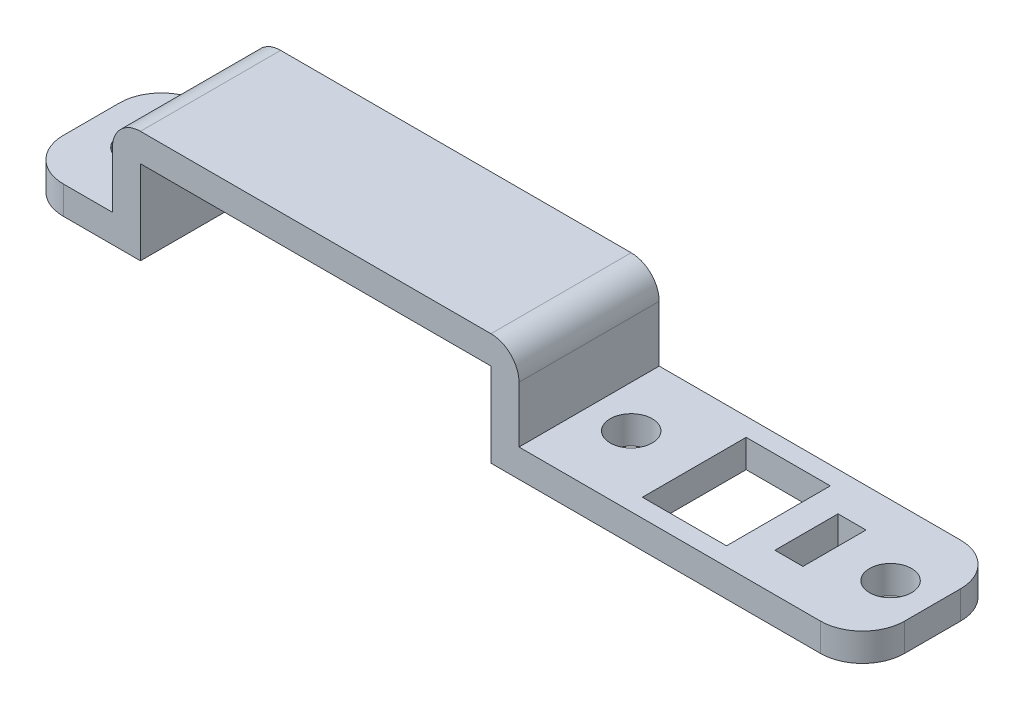
ISO-10303-21;
HEADER;
FILE_DESCRIPTION(('STEP AP214'),'2;1');
FILE_NAME('part.step','',(''),(''),'','','');
FILE_SCHEMA(('AUTOMOTIVE_DESIGN { 1 0 10303 214 1 1 1 1 }'));
ENDSEC;
DATA;
#1=APPLICATION_CONTEXT('core data for automotive mechanical design processes');
#2=APPLICATION_PROTOCOL_DEFINITION('international standard','automotive_design',2000,#1);
#3=PRODUCT_CONTEXT('',#1,'mechanical');
#4=PRODUCT('Part','Part','',(#3));
#5=PRODUCT_RELATED_PRODUCT_CATEGORY('part','',(#4));
#6=PRODUCT_DEFINITION_FORMATION('','',#4);
#7=PRODUCT_DEFINITION_CONTEXT('part definition',#1,'design');
#8=PRODUCT_DEFINITION('design','',#6,#7);
#9=PRODUCT_DEFINITION_SHAPE('','',#8);
#10=(LENGTH_UNIT() NAMED_UNIT(*) SI_UNIT(.MILLI.,.METRE.));
#11=(NAMED_UNIT(*) PLANE_ANGLE_UNIT() SI_UNIT($,.RADIAN.));
#12=(NAMED_UNIT(*) SI_UNIT($,.STERADIAN.) SOLID_ANGLE_UNIT());
#13=UNCERTAINTY_MEASURE_WITH_UNIT(LENGTH_MEASURE(1.E-05),#10,'distance_accuracy_value','');
#14=(GEOMETRIC_REPRESENTATION_CONTEXT(3) GLOBAL_UNCERTAINTY_ASSIGNED_CONTEXT((#13)) GLOBAL_UNIT_ASSIGNED_CONTEXT((#10,
#11,#12)) REPRESENTATION_CONTEXT('',''));
#15=CARTESIAN_POINT('',(0.,0.,0.));
#16=DIRECTION('',(0.,0.,1.));
#17=DIRECTION('',(1.,0.,0.));
#18=AXIS2_PLACEMENT_3D('',#15,#16,#17);
#19=CARTESIAN_POINT('',(32.5,0.,-10.));
#20=DIRECTION('',(0.,-1.,0.));
#21=DIRECTION('',(0.,0.,-1.));
#22=AXIS2_PLACEMENT_3D('',#19,#20,#21);
#23=PLANE('',#22);
#24=DIRECTION('',(0.,0.,1.));
#25=VECTOR('',#24,1.);
#26=CARTESIAN_POINT('',(42.,0.,-8.7));
#27=LINE('',#26,#25);
#28=CARTESIAN_POINT('',(42.,0.,-8.7));
#29=VERTEX_POINT('',#28);
#30=CARTESIAN_POINT('',(42.,0.,-1.3));
#31=VERTEX_POINT('',#30);
#32=EDGE_CURVE('E216',#29,#31,#27,.T.);
#33=ORIENTED_EDGE('',*,*,#32,.T.);
#34=DIRECTION('',(1.,0.,0.));
#35=VECTOR('',#34,1.);
#36=CARTESIAN_POINT('',(42.,0.,-1.3));
#37=LINE('',#36,#35);
#38=CARTESIAN_POINT('',(48.,0.,-1.3));
#39=VERTEX_POINT('',#38);
#40=EDGE_CURVE('E228',#31,#39,#37,.T.);
#41=ORIENTED_EDGE('',*,*,#40,.T.);
#42=DIRECTION('',(0.,0.,-1.));
#43=VECTOR('',#42,1.);
#44=CARTESIAN_POINT('',(48.,0.,-8.7));
#45=LINE('',#44,#43);
#46=CARTESIAN_POINT('',(48.,0.,-8.7));
#47=VERTEX_POINT('',#46);
#48=EDGE_CURVE('E55',#39,#47,#45,.T.);
#49=ORIENTED_EDGE('',*,*,#48,.T.);
#50=DIRECTION('',(-1.,0.,0.));
#51=VECTOR('',#50,1.);
#52=CARTESIAN_POINT('',(42.,0.,-8.7));
#53=LINE('',#52,#51);
#54=EDGE_CURVE('E225',#47,#29,#53,.T.);
#55=ORIENTED_EDGE('',*,*,#54,.T.);
#56=EDGE_LOOP('',(#33,#41,#49,#55));
#57=FACE_BOUND('',#56,.T.);
#58=DIRECTION('',(0.,0.,1.));
#59=VECTOR('',#58,1.);
#60=CARTESIAN_POINT('',(50.,0.,-7.25));
#61=LINE('',#60,#59);
#62=CARTESIAN_POINT('',(50.,0.,-7.25));
#63=VERTEX_POINT('',#62);
#64=CARTESIAN_POINT('',(50.,0.,-2.75));
#65=VERTEX_POINT('',#64);
#66=EDGE_CURVE('E265',#63,#65,#61,.T.);
#67=ORIENTED_EDGE('',*,*,#66,.T.);
#68=DIRECTION('',(1.,0.,0.));
#69=VECTOR('',#68,1.);
#70=CARTESIAN_POINT('',(50.,0.,-2.75));
#71=LINE('',#70,#69);
#72=CARTESIAN_POINT('',(52.,0.,-2.75));
#73=VERTEX_POINT('',#72);
#74=EDGE_CURVE('E269',#65,#73,#71,.T.);
#75=ORIENTED_EDGE('',*,*,#74,.T.);
#76=DIRECTION('',(0.,0.,-1.));
#77=VECTOR('',#76,1.);
#78=CARTESIAN_POINT('',(52.,0.,-7.25));
#79=LINE('',#78,#77);
#80=CARTESIAN_POINT('',(52.,0.,-7.25));
#81=VERTEX_POINT('',#80);
#82=EDGE_CURVE('E63',#73,#81,#79,.T.);
#83=ORIENTED_EDGE('',*,*,#82,.T.);
#84=DIRECTION('',(-1.,0.,0.));
#85=VECTOR('',#84,1.);
#86=CARTESIAN_POINT('',(50.,0.,-7.25));
#87=LINE('',#86,#85);
#88=EDGE_CURVE('E276',#81,#63,#87,.T.);
#89=ORIENTED_EDGE('',*,*,#88,.T.);
#90=EDGE_LOOP('',(#67,#75,#83,#89));
#91=FACE_BOUND('',#90,.T.);
#92=CARTESIAN_POINT('',(37.5,0.,-5.));
#93=DIRECTION('',(0.,1.,0.));
#94=DIRECTION('',(0.,0.,1.));
#95=AXIS2_PLACEMENT_3D('',#92,#93,#94);
#96=CIRCLE('',#95,1.5);
#97=CARTESIAN_POINT('',(37.5,0.,-3.5));
#98=VERTEX_POINT('',#97);
#99=EDGE_CURVE('E315',#98,#98,#96,.T.);
#100=ORIENTED_EDGE('',*,*,#99,.T.);
#101=EDGE_LOOP('',(#100));
#102=FACE_BOUND('',#101,.T.);
#103=CARTESIAN_POINT('',(56.,0.,-5.));
#104=DIRECTION('',(0.,1.,0.));
#105=DIRECTION('',(0.,0.,1.));
#106=AXIS2_PLACEMENT_3D('',#103,#104,#105);
#107=CIRCLE('',#106,1.5);
#108=CARTESIAN_POINT('',(56.,0.,-3.5));
#109=VERTEX_POINT('',#108);
#110=EDGE_CURVE('E323',#109,#109,#107,.T.);
#111=ORIENTED_EDGE('',*,*,#110,.T.);
#112=EDGE_LOOP('',(#111));
#113=FACE_BOUND('',#112,.T.);
#114=DIRECTION('',(1.,0.,0.));
#115=VECTOR('',#114,1.);
#116=CARTESIAN_POINT('',(41.5,0.,-10.));
#117=LINE('',#116,#115);
#118=CARTESIAN_POINT('',(32.5,0.,-10.));
#119=VERTEX_POINT('',#118);
#120=CARTESIAN_POINT('',(56.,0.,-10.));
#121=VERTEX_POINT('',#120);
#122=EDGE_CURVE('E330',#119,#121,#117,.T.);
#123=ORIENTED_EDGE('',*,*,#122,.T.);
#124=CARTESIAN_POINT('',(56.,0.,-7.));
#125=DIRECTION('',(0.,-1.,0.));
#126=DIRECTION('',(0.,0.,-1.));
#127=AXIS2_PLACEMENT_3D('',#124,#125,#126);
#128=CIRCLE('',#127,3.);
#129=CARTESIAN_POINT('',(59.,0.,-7.));
#130=VERTEX_POINT('',#129);
#131=EDGE_CURVE('E476',#121,#130,#128,.T.);
#132=ORIENTED_EDGE('',*,*,#131,.T.);
#133=DIRECTION('',(0.,0.,1.));
#134=VECTOR('',#133,1.);
#135=CARTESIAN_POINT('',(59.,0.,-10.));
#136=LINE('',#135,#134);
#137=CARTESIAN_POINT('',(59.,0.,-3.));
#138=VERTEX_POINT('',#137);
#139=EDGE_CURVE('E368',#130,#138,#136,.T.);
#140=ORIENTED_EDGE('',*,*,#139,.T.);
#141=CARTESIAN_POINT('',(56.,0.,-3.));
#142=DIRECTION('',(0.,-1.,0.));
#143=DIRECTION('',(0.,0.,-1.));
#144=AXIS2_PLACEMENT_3D('',#141,#142,#143);
#145=CIRCLE('',#144,3.);
#146=CARTESIAN_POINT('',(56.,0.,0.));
#147=VERTEX_POINT('',#146);
#148=EDGE_CURVE('E473',#138,#147,#145,.T.);
#149=ORIENTED_EDGE('',*,*,#148,.T.);
#150=DIRECTION('',(1.,0.,0.));
#151=VECTOR('',#150,1.);
#152=CARTESIAN_POINT('',(32.5,0.,0.));
#153=LINE('',#152,#151);
#154=CARTESIAN_POINT('',(32.5,0.,0.));
#155=VERTEX_POINT('',#154);
#156=EDGE_CURVE('E335',#155,#147,#153,.T.);
#157=ORIENTED_EDGE('',*,*,#156,.F.);
#158=DIRECTION('',(0.,0.,1.));
#159=VECTOR('',#158,1.);
#160=CARTESIAN_POINT('',(32.5,0.,-10.));
#161=LINE('',#160,#159);
#162=EDGE_CURVE('E404',#119,#155,#161,.T.);
#163=ORIENTED_EDGE('',*,*,#162,.F.);
#164=EDGE_LOOP('',(#123,#132,#140,#149,#157,#163));
#165=FACE_BOUND('',#164,.T.);
#166=ADVANCED_FACE('F39',(#57,#91,#102,#113,#165),#23,.T.);
#167=CARTESIAN_POINT('',(32.5,6.,-10.));
#168=DIRECTION('',(-1.,0.,0.));
#169=DIRECTION('',(0.,0.,1.));
#170=AXIS2_PLACEMENT_3D('',#167,#168,#169);
#171=PLANE('',#170);
#172=DIRECTION('',(0.,-1.,0.));
#173=VECTOR('',#172,1.);
#174=CARTESIAN_POINT('',(32.5,6.,0.));
#175=LINE('',#174,#173);
#176=CARTESIAN_POINT('',(32.5,6.,0.));
#177=VERTEX_POINT('',#176);
#178=EDGE_CURVE('E397',#177,#155,#175,.T.);
#179=ORIENTED_EDGE('',*,*,#178,.F.);
#180=DIRECTION('',(0.,0.,1.));
#181=VECTOR('',#180,1.);
#182=CARTESIAN_POINT('',(32.5,6.,-10.));
#183=LINE('',#182,#181);
#184=CARTESIAN_POINT('',(32.5,6.,-10.));
#185=VERTEX_POINT('',#184);
#186=EDGE_CURVE('E408',#185,#177,#183,.T.);
#187=ORIENTED_EDGE('',*,*,#186,.F.);
#188=DIRECTION('',(0.,-1.,0.));
#189=VECTOR('',#188,1.);
#190=CARTESIAN_POINT('',(32.5,6.,-10.));
#191=LINE('',#190,#189);
#192=EDGE_CURVE('E364',#185,#119,#191,.T.);
#193=ORIENTED_EDGE('',*,*,#192,.T.);
#194=ORIENTED_EDGE('',*,*,#162,.T.);
#195=EDGE_LOOP('',(#179,#187,#193,#194));
#196=FACE_BOUND('',#195,.T.);
#197=ADVANCED_FACE('F576',(#196),#171,.T.);
#198=CARTESIAN_POINT('',(7.5,6.,-10.));
#199=DIRECTION('',(0.,-1.,0.));
#200=DIRECTION('',(0.,0.,-1.));
#201=AXIS2_PLACEMENT_3D('',#198,#199,#200);
#202=PLANE('',#201);
#203=DIRECTION('',(1.,0.,0.));
#204=VECTOR('',#203,1.);
#205=CARTESIAN_POINT('',(7.5,6.,0.));
#206=LINE('',#205,#204);
#207=CARTESIAN_POINT('',(7.5,6.,0.));
#208=VERTEX_POINT('',#207);
#209=EDGE_CURVE('E393',#208,#177,#206,.T.);
#210=ORIENTED_EDGE('',*,*,#209,.F.);
#211=DIRECTION('',(0.,0.,1.));
#212=VECTOR('',#211,1.);
#213=CARTESIAN_POINT('',(7.5,6.,-10.));
#214=LINE('',#213,#212);
#215=CARTESIAN_POINT('',(7.5,6.,-10.));
#216=VERTEX_POINT('',#215);
#217=EDGE_CURVE('E411',#216,#208,#214,.T.);
#218=ORIENTED_EDGE('',*,*,#217,.F.);
#219=DIRECTION('',(1.,0.,0.));
#220=VECTOR('',#219,1.);
#221=CARTESIAN_POINT('',(7.5,6.,-10.));
#222=LINE('',#221,#220);
#223=EDGE_CURVE('E360',#216,#185,#222,.T.);
#224=ORIENTED_EDGE('',*,*,#223,.T.);
#225=ORIENTED_EDGE('',*,*,#186,.T.);
#226=EDGE_LOOP('',(#210,#218,#224,#225));
#227=FACE_BOUND('',#226,.T.);
#228=ADVANCED_FACE('F574',(#227),#202,.T.);
#229=CARTESIAN_POINT('',(7.5,0.,-10.));
#230=DIRECTION('',(1.,0.,0.));
#231=DIRECTION('',(0.,0.,-1.));
#232=AXIS2_PLACEMENT_3D('',#229,#230,#231);
#233=PLANE('',#232);
#234=DIRECTION('',(0.,1.,0.));
#235=VECTOR('',#234,1.);
#236=CARTESIAN_POINT('',(7.5,0.,0.));
#237=LINE('',#236,#235);
#238=CARTESIAN_POINT('',(7.5,0.,0.));
#239=VERTEX_POINT('',#238);
#240=EDGE_CURVE('E389',#239,#208,#237,.T.);
#241=ORIENTED_EDGE('',*,*,#240,.F.);
#242=DIRECTION('',(0.,0.,1.));
#243=VECTOR('',#242,1.);
#244=CARTESIAN_POINT('',(7.5,0.,-10.));
#245=LINE('',#244,#243);
#246=CARTESIAN_POINT('',(7.5,0.,-10.));
#247=VERTEX_POINT('',#246);
#248=EDGE_CURVE('E414',#247,#239,#245,.T.);
#249=ORIENTED_EDGE('',*,*,#248,.F.);
#250=DIRECTION('',(0.,1.,0.));
#251=VECTOR('',#250,1.);
#252=CARTESIAN_POINT('',(7.5,0.,-10.));
#253=LINE('',#252,#251);
#254=EDGE_CURVE('E356',#247,#216,#253,.T.);
#255=ORIENTED_EDGE('',*,*,#254,.T.);
#256=ORIENTED_EDGE('',*,*,#217,.T.);
#257=EDGE_LOOP('',(#241,#249,#255,#256));
#258=FACE_BOUND('',#257,.T.);
#259=ADVANCED_FACE('F569',(#258),#233,.T.);
#260=CARTESIAN_POINT('',(0.,0.,-10.));
#261=DIRECTION('',(0.,-1.,0.));
#262=DIRECTION('',(0.,0.,-1.));
#263=AXIS2_PLACEMENT_3D('',#260,#261,#262);
#264=PLANE('',#263);
#265=CARTESIAN_POINT('',(2.5,0.,-5.));
#266=DIRECTION('',(0.,1.,0.));
#267=DIRECTION('',(0.,0.,1.));
#268=AXIS2_PLACEMENT_3D('',#265,#266,#267);
#269=CIRCLE('',#268,1.5);
#270=CARTESIAN_POINT('',(2.5,0.,-3.5));
#271=VERTEX_POINT('',#270);
#272=EDGE_CURVE('E306',#271,#271,#269,.T.);
#273=ORIENTED_EDGE('',*,*,#272,.T.);
#274=EDGE_LOOP('',(#273));
#275=FACE_BOUND('',#274,.T.);
#276=DIRECTION('',(0.,0.,1.));
#277=VECTOR('',#276,1.);
#278=CARTESIAN_POINT('',(-1.,0.,-10.));
#279=LINE('',#278,#277);
#280=CARTESIAN_POINT('',(-1.,0.,-7.));
#281=VERTEX_POINT('',#280);
#282=CARTESIAN_POINT('',(-1.,0.,-3.));
#283=VERTEX_POINT('',#282);
#284=EDGE_CURVE('E418',#281,#283,#279,.T.);
#285=ORIENTED_EDGE('',*,*,#284,.F.);
#286=CARTESIAN_POINT('',(2.,0.,-7.));
#287=DIRECTION('',(0.,-1.,0.));
#288=DIRECTION('',(0.,0.,-1.));
#289=AXIS2_PLACEMENT_3D('',#286,#287,#288);
#290=CIRCLE('',#289,3.);
#291=CARTESIAN_POINT('',(2.,0.,-10.));
#292=VERTEX_POINT('',#291);
#293=EDGE_CURVE('E464',#281,#292,#290,.T.);
#294=ORIENTED_EDGE('',*,*,#293,.T.);
#295=DIRECTION('',(1.,0.,0.));
#296=VECTOR('',#295,1.);
#297=CARTESIAN_POINT('',(0.,0.,-10.));
#298=LINE('',#297,#296);
#299=EDGE_CURVE('E353',#292,#247,#298,.T.);
#300=ORIENTED_EDGE('',*,*,#299,.T.);
#301=ORIENTED_EDGE('',*,*,#248,.T.);
#302=DIRECTION('',(1.,0.,0.));
#303=VECTOR('',#302,1.);
#304=CARTESIAN_POINT('',(0.,0.,0.));
#305=LINE('',#304,#303);
#306=CARTESIAN_POINT('',(2.,0.,0.));
#307=VERTEX_POINT('',#306);
#308=EDGE_CURVE('E386',#307,#239,#305,.T.);
#309=ORIENTED_EDGE('',*,*,#308,.F.);
#310=CARTESIAN_POINT('',(2.,0.,-3.));
#311=DIRECTION('',(0.,-1.,0.));
#312=DIRECTION('',(0.,0.,-1.));
#313=AXIS2_PLACEMENT_3D('',#310,#311,#312);
#314=CIRCLE('',#313,3.);
#315=EDGE_CURVE('E461',#307,#283,#314,.T.);
#316=ORIENTED_EDGE('',*,*,#315,.T.);
#317=EDGE_LOOP('',(#285,#294,#300,#301,#309,#316));
#318=FACE_BOUND('',#317,.T.);
#319=ADVANCED_FACE('F553',(#275,#318),#264,.T.);
#320=CARTESIAN_POINT('',(-1.,0.,-10.));
#321=DIRECTION('',(1.,0.,0.));
#322=DIRECTION('',(0.,1.,0.));
#323=AXIS2_PLACEMENT_3D('',#320,#321,#322);
#324=PLANE('',#323);
#325=DIRECTION('',(0.,0.,1.));
#326=VECTOR('',#325,1.);
#327=CARTESIAN_POINT('',(-1.,2.,-10.));
#328=LINE('',#327,#326);
#329=CARTESIAN_POINT('',(-1.,2.,-7.));
#330=VERTEX_POINT('',#329);
#331=CARTESIAN_POINT('',(-1.,2.,-3.));
#332=VERTEX_POINT('',#331);
#333=EDGE_CURVE('E422',#330,#332,#328,.T.);
#334=ORIENTED_EDGE('',*,*,#333,.F.);
#335=DIRECTION('',(0.,1.,0.));
#336=VECTOR('',#335,1.);
#337=CARTESIAN_POINT('',(-1.,0.,-7.));
#338=LINE('',#337,#336);
#339=EDGE_CURVE('E458',#330,#281,#338,.F.);
#340=ORIENTED_EDGE('',*,*,#339,.T.);
#341=ORIENTED_EDGE('',*,*,#284,.T.);
#342=DIRECTION('',(0.,1.,0.));
#343=VECTOR('',#342,1.);
#344=CARTESIAN_POINT('',(-1.,0.,-3.));
#345=LINE('',#344,#343);
#346=EDGE_CURVE('E454',#283,#332,#345,.T.);
#347=ORIENTED_EDGE('',*,*,#346,.T.);
#348=EDGE_LOOP('',(#334,#340,#341,#347));
#349=FACE_BOUND('',#348,.T.);
#350=ADVANCED_FACE('F557',(#349),#324,.F.);
#351=CARTESIAN_POINT('',(0.,2.,-10.));
#352=DIRECTION('',(0.,-1.,0.));
#353=DIRECTION('',(1.,0.,0.));
#354=AXIS2_PLACEMENT_3D('',#351,#352,#353);
#355=PLANE('',#354);
#356=CARTESIAN_POINT('',(2.5,2.,-5.));
#357=DIRECTION('',(0.,1.,0.));
#358=DIRECTION('',(0.,0.,1.));
#359=AXIS2_PLACEMENT_3D('',#356,#357,#358);
#360=CIRCLE('',#359,1.5);
#361=CARTESIAN_POINT('',(2.5,2.,-3.5));
#362=VERTEX_POINT('',#361);
#363=EDGE_CURVE('E311',#362,#362,#360,.T.);
#364=ORIENTED_EDGE('',*,*,#363,.F.);
#365=EDGE_LOOP('',(#364));
#366=FACE_BOUND('',#365,.T.);
#367=DIRECTION('',(1.,0.,0.));
#368=VECTOR('',#367,1.);
#369=CARTESIAN_POINT('',(0.,2.,-10.));
#370=LINE('',#369,#368);
#371=CARTESIAN_POINT('',(2.,2.,-10.));
#372=VERTEX_POINT('',#371);
#373=CARTESIAN_POINT('',(5.5,2.,-10.));
#374=VERTEX_POINT('',#373);
#375=EDGE_CURVE('E350',#372,#374,#370,.T.);
#376=ORIENTED_EDGE('',*,*,#375,.F.);
#377=CARTESIAN_POINT('',(2.,2.,-7.));
#378=DIRECTION('',(0.,-1.,0.));
#379=DIRECTION('',(1.,0.,0.));
#380=AXIS2_PLACEMENT_3D('',#377,#378,#379);
#381=CIRCLE('',#380,3.);
#382=EDGE_CURVE('E451',#372,#330,#381,.F.);
#383=ORIENTED_EDGE('',*,*,#382,.T.);
#384=ORIENTED_EDGE('',*,*,#333,.T.);
#385=CARTESIAN_POINT('',(2.,2.,-3.));
#386=DIRECTION('',(0.,-1.,0.));
#387=DIRECTION('',(1.,0.,0.));
#388=AXIS2_PLACEMENT_3D('',#385,#386,#387);
#389=CIRCLE('',#388,3.);
#390=CARTESIAN_POINT('',(2.,2.,0.));
#391=VERTEX_POINT('',#390);
#392=EDGE_CURVE('E448',#332,#391,#389,.F.);
#393=ORIENTED_EDGE('',*,*,#392,.T.);
#394=DIRECTION('',(1.,0.,0.));
#395=VECTOR('',#394,1.);
#396=CARTESIAN_POINT('',(0.,2.,0.));
#397=LINE('',#396,#395);
#398=CARTESIAN_POINT('',(5.5,2.,0.));
#399=VERTEX_POINT('',#398);
#400=EDGE_CURVE('E383',#391,#399,#397,.T.);
#401=ORIENTED_EDGE('',*,*,#400,.T.);
#402=DIRECTION('',(0.,0.,1.));
#403=VECTOR('',#402,1.);
#404=CARTESIAN_POINT('',(5.5,2.,-10.));
#405=LINE('',#404,#403);
#406=EDGE_CURVE('E426',#374,#399,#405,.T.);
#407=ORIENTED_EDGE('',*,*,#406,.F.);
#408=EDGE_LOOP('',(#376,#383,#384,#393,#401,#407));
#409=FACE_BOUND('',#408,.T.);
#410=ADVANCED_FACE('F544',(#366,#409),#355,.F.);
#411=CARTESIAN_POINT('',(5.5,0.,-10.));
#412=DIRECTION('',(1.,0.,0.));
#413=DIRECTION('',(0.,0.,-1.));
#414=AXIS2_PLACEMENT_3D('',#411,#412,#413);
#415=PLANE('',#414);
#416=DIRECTION('',(0.,1.,0.));
#417=VECTOR('',#416,1.);
#418=CARTESIAN_POINT('',(5.5,0.,0.));
#419=LINE('',#418,#417);
#420=CARTESIAN_POINT('',(5.5,6.,0.));
#421=VERTEX_POINT('',#420);
#422=EDGE_CURVE('E379',#399,#421,#419,.T.);
#423=ORIENTED_EDGE('',*,*,#422,.T.);
#424=DIRECTION('',(0.,0.,1.));
#425=VECTOR('',#424,1.);
#426=CARTESIAN_POINT('',(5.5,6.,-10.));
#427=LINE('',#426,#425);
#428=CARTESIAN_POINT('',(5.5,6.,-10.));
#429=VERTEX_POINT('',#428);
#430=EDGE_CURVE('E11',#421,#429,#427,.F.);
#431=ORIENTED_EDGE('',*,*,#430,.T.);
#432=DIRECTION('',(0.,1.,0.));
#433=VECTOR('',#432,1.);
#434=CARTESIAN_POINT('',(5.5,0.,-10.));
#435=LINE('',#434,#433);
#436=EDGE_CURVE('E346',#374,#429,#435,.T.);
#437=ORIENTED_EDGE('',*,*,#436,.F.);
#438=ORIENTED_EDGE('',*,*,#406,.T.);
#439=EDGE_LOOP('',(#423,#431,#437,#438));
#440=FACE_BOUND('',#439,.T.);
#441=ADVANCED_FACE('F539',(#440),#415,.F.);
#442=CARTESIAN_POINT('',(7.5,8.,-10.));
#443=DIRECTION('',(0.,-1.,0.));
#444=DIRECTION('',(0.,0.,-1.));
#445=AXIS2_PLACEMENT_3D('',#442,#443,#444);
#446=PLANE('',#445);
#447=DIRECTION('',(1.,0.,0.));
#448=VECTOR('',#447,1.);
#449=CARTESIAN_POINT('',(7.5,8.,0.));
#450=LINE('',#449,#448);
#451=CARTESIAN_POINT('',(7.5,8.,0.));
#452=VERTEX_POINT('',#451);
#453=CARTESIAN_POINT('',(32.5,8.,0.));
#454=VERTEX_POINT('',#453);
#455=EDGE_CURVE('E375',#452,#454,#450,.T.);
#456=ORIENTED_EDGE('',*,*,#455,.T.);
#457=DIRECTION('',(0.,0.,1.));
#458=VECTOR('',#457,1.);
#459=CARTESIAN_POINT('',(32.5,8.,-10.));
#460=LINE('',#459,#458);
#461=CARTESIAN_POINT('',(32.5,8.,-10.));
#462=VERTEX_POINT('',#461);
#463=EDGE_CURVE('E506',#454,#462,#460,.F.);
#464=ORIENTED_EDGE('',*,*,#463,.T.);
#465=DIRECTION('',(1.,0.,0.));
#466=VECTOR('',#465,1.);
#467=CARTESIAN_POINT('',(7.5,8.,-10.));
#468=LINE('',#467,#466);
#469=CARTESIAN_POINT('',(7.5,8.,-10.));
#470=VERTEX_POINT('',#469);
#471=EDGE_CURVE('E342',#470,#462,#468,.T.);
#472=ORIENTED_EDGE('',*,*,#471,.F.);
#473=DIRECTION('',(0.,0.,1.));
#474=VECTOR('',#473,1.);
#475=CARTESIAN_POINT('',(7.5,8.,-10.));
#476=LINE('',#475,#474);
#477=EDGE_CURVE('E502',#470,#452,#476,.T.);
#478=ORIENTED_EDGE('',*,*,#477,.T.);
#479=EDGE_LOOP('',(#456,#464,#472,#478));
#480=FACE_BOUND('',#479,.T.);
#481=ADVANCED_FACE('F531',(#480),#446,.F.);
#482=CARTESIAN_POINT('',(34.5,6.,-10.));
#483=DIRECTION('',(-1.,0.,0.));
#484=DIRECTION('',(0.,0.,1.));
#485=AXIS2_PLACEMENT_3D('',#482,#483,#484);
#486=PLANE('',#485);
#487=DIRECTION('',(0.,1.,0.));
#488=VECTOR('',#487,1.);
#489=CARTESIAN_POINT('',(34.5,6.,-10.));
#490=LINE('',#489,#488);
#491=CARTESIAN_POINT('',(34.5,6.,-10.));
#492=VERTEX_POINT('',#491);
#493=CARTESIAN_POINT('',(34.5,2.,-10.));
#494=VERTEX_POINT('',#493);
#495=EDGE_CURVE('E339',#492,#494,#490,.F.);
#496=ORIENTED_EDGE('',*,*,#495,.F.);
#497=DIRECTION('',(0.,0.,1.));
#498=VECTOR('',#497,1.);
#499=CARTESIAN_POINT('',(34.5,6.,-10.));
#500=LINE('',#499,#498);
#501=CARTESIAN_POINT('',(34.5,6.,0.));
#502=VERTEX_POINT('',#501);
#503=EDGE_CURVE('E492',#492,#502,#500,.T.);
#504=ORIENTED_EDGE('',*,*,#503,.T.);
#505=DIRECTION('',(0.,1.,0.));
#506=VECTOR('',#505,1.);
#507=CARTESIAN_POINT('',(34.5,6.,0.));
#508=LINE('',#507,#506);
#509=CARTESIAN_POINT('',(34.5,2.,0.));
#510=VERTEX_POINT('',#509);
#511=EDGE_CURVE('E372',#502,#510,#508,.F.);
#512=ORIENTED_EDGE('',*,*,#511,.T.);
#513=DIRECTION('',(0.,0.,1.));
#514=VECTOR('',#513,1.);
#515=CARTESIAN_POINT('',(34.5,2.,-10.));
#516=LINE('',#515,#514);
#517=EDGE_CURVE('E430',#494,#510,#516,.T.);
#518=ORIENTED_EDGE('',*,*,#517,.F.);
#519=EDGE_LOOP('',(#496,#504,#512,#518));
#520=FACE_BOUND('',#519,.T.);
#521=ADVANCED_FACE('F523',(#520),#486,.F.);
#522=CARTESIAN_POINT('',(32.5,2.,-10.));
#523=DIRECTION('',(0.,-1.,0.));
#524=DIRECTION('',(0.,0.,-1.));
#525=AXIS2_PLACEMENT_3D('',#522,#523,#524);
#526=PLANE('',#525);
#527=DIRECTION('',(1.,0.,0.));
#528=VECTOR('',#527,1.);
#529=CARTESIAN_POINT('',(42.,2.,-1.3));
#530=LINE('',#529,#528);
#531=CARTESIAN_POINT('',(42.,2.,-1.3));
#532=VERTEX_POINT('',#531);
#533=CARTESIAN_POINT('',(48.,2.,-1.3));
#534=VERTEX_POINT('',#533);
#535=EDGE_CURVE('E249',#532,#534,#530,.T.);
#536=ORIENTED_EDGE('',*,*,#535,.F.);
#537=DIRECTION('',(0.,0.,1.));
#538=VECTOR('',#537,1.);
#539=CARTESIAN_POINT('',(42.,2.,-8.7));
#540=LINE('',#539,#538);
#541=CARTESIAN_POINT('',(42.,2.,-8.7));
#542=VERTEX_POINT('',#541);
#543=EDGE_CURVE('E219',#542,#532,#540,.T.);
#544=ORIENTED_EDGE('',*,*,#543,.F.);
#545=DIRECTION('',(-1.,0.,0.));
#546=VECTOR('',#545,1.);
#547=CARTESIAN_POINT('',(42.,2.,-8.7));
#548=LINE('',#547,#546);
#549=CARTESIAN_POINT('',(48.,2.,-8.7));
#550=VERTEX_POINT('',#549);
#551=EDGE_CURVE('E236',#550,#542,#548,.T.);
#552=ORIENTED_EDGE('',*,*,#551,.F.);
#553=DIRECTION('',(0.,0.,-1.));
#554=VECTOR('',#553,1.);
#555=CARTESIAN_POINT('',(48.,2.,-8.7));
#556=LINE('',#555,#554);
#557=EDGE_CURVE('E240',#534,#550,#556,.T.);
#558=ORIENTED_EDGE('',*,*,#557,.F.);
#559=EDGE_LOOP('',(#536,#544,#552,#558));
#560=FACE_BOUND('',#559,.T.);
#561=DIRECTION('',(1.,0.,0.));
#562=VECTOR('',#561,1.);
#563=CARTESIAN_POINT('',(50.,2.,-2.75));
#564=LINE('',#563,#562);
#565=CARTESIAN_POINT('',(50.,2.,-2.75));
#566=VERTEX_POINT('',#565);
#567=CARTESIAN_POINT('',(52.,2.,-2.75));
#568=VERTEX_POINT('',#567);
#569=EDGE_CURVE('E284',#566,#568,#564,.T.);
#570=ORIENTED_EDGE('',*,*,#569,.F.);
#571=DIRECTION('',(0.,0.,1.));
#572=VECTOR('',#571,1.);
#573=CARTESIAN_POINT('',(50.,2.,-7.25));
#574=LINE('',#573,#572);
#575=CARTESIAN_POINT('',(50.,2.,-7.25));
#576=VERTEX_POINT('',#575);
#577=EDGE_CURVE('E281',#576,#566,#574,.T.);
#578=ORIENTED_EDGE('',*,*,#577,.F.);
#579=DIRECTION('',(-1.,0.,0.));
#580=VECTOR('',#579,1.);
#581=CARTESIAN_POINT('',(50.,2.,-7.25));
#582=LINE('',#581,#580);
#583=CARTESIAN_POINT('',(52.,2.,-7.25));
#584=VERTEX_POINT('',#583);
#585=EDGE_CURVE('E270',#584,#576,#582,.T.);
#586=ORIENTED_EDGE('',*,*,#585,.F.);
#587=DIRECTION('',(0.,0.,-1.));
#588=VECTOR('',#587,1.);
#589=CARTESIAN_POINT('',(52.,2.,-7.25));
#590=LINE('',#589,#588);
#591=EDGE_CURVE('E288',#568,#584,#590,.T.);
#592=ORIENTED_EDGE('',*,*,#591,.F.);
#593=EDGE_LOOP('',(#570,#578,#586,#592));
#594=FACE_BOUND('',#593,.T.);
#595=CARTESIAN_POINT('',(37.5,2.,-5.));
#596=DIRECTION('',(0.,1.,0.));
#597=DIRECTION('',(0.,0.,1.));
#598=AXIS2_PLACEMENT_3D('',#595,#596,#597);
#599=CIRCLE('',#598,1.5);
#600=CARTESIAN_POINT('',(37.5,2.,-3.5));
#601=VERTEX_POINT('',#600);
#602=EDGE_CURVE('E319',#601,#601,#599,.T.);
#603=ORIENTED_EDGE('',*,*,#602,.F.);
#604=EDGE_LOOP('',(#603));
#605=FACE_BOUND('',#604,.T.);
#606=CARTESIAN_POINT('',(56.,2.,-5.));
#607=DIRECTION('',(0.,1.,0.));
#608=DIRECTION('',(0.,0.,1.));
#609=AXIS2_PLACEMENT_3D('',#606,#607,#608);
#610=CIRCLE('',#609,1.5);
#611=CARTESIAN_POINT('',(56.,2.,-3.5));
#612=VERTEX_POINT('',#611);
#613=EDGE_CURVE('E259',#612,#612,#610,.T.);
#614=ORIENTED_EDGE('',*,*,#613,.F.);
#615=EDGE_LOOP('',(#614));
#616=FACE_BOUND('',#615,.T.);
#617=DIRECTION('',(0.,0.,1.));
#618=VECTOR('',#617,1.);
#619=CARTESIAN_POINT('',(59.,2.,-10.));
#620=LINE('',#619,#618);
#621=CARTESIAN_POINT('',(59.,2.,-7.));
#622=VERTEX_POINT('',#621);
#623=CARTESIAN_POINT('',(59.,2.,-3.));
#624=VERTEX_POINT('',#623);
#625=EDGE_CURVE('E434',#622,#624,#620,.T.);
#626=ORIENTED_EDGE('',*,*,#625,.F.);
#627=CARTESIAN_POINT('',(56.,2.,-7.));
#628=DIRECTION('',(0.,-1.,0.));
#629=DIRECTION('',(0.,0.,-1.));
#630=AXIS2_PLACEMENT_3D('',#627,#628,#629);
#631=CIRCLE('',#630,3.);
#632=CARTESIAN_POINT('',(56.,2.,-10.));
#633=VERTEX_POINT('',#632);
#634=EDGE_CURVE('E489',#622,#633,#631,.F.);
#635=ORIENTED_EDGE('',*,*,#634,.T.);
#636=DIRECTION('',(1.,0.,0.));
#637=VECTOR('',#636,1.);
#638=CARTESIAN_POINT('',(41.5,2.,-10.));
#639=LINE('',#638,#637);
#640=EDGE_CURVE('E334',#494,#633,#639,.T.);
#641=ORIENTED_EDGE('',*,*,#640,.F.);
#642=ORIENTED_EDGE('',*,*,#517,.T.);
#643=DIRECTION('',(1.,0.,0.));
#644=VECTOR('',#643,1.);
#645=CARTESIAN_POINT('',(32.5,2.,0.));
#646=LINE('',#645,#644);
#647=CARTESIAN_POINT('',(56.,2.,0.));
#648=VERTEX_POINT('',#647);
#649=EDGE_CURVE('E310',#510,#648,#646,.T.);
#650=ORIENTED_EDGE('',*,*,#649,.T.);
#651=CARTESIAN_POINT('',(56.,2.,-3.));
#652=DIRECTION('',(0.,-1.,0.));
#653=DIRECTION('',(0.,0.,-1.));
#654=AXIS2_PLACEMENT_3D('',#651,#652,#653);
#655=CIRCLE('',#654,3.);
#656=EDGE_CURVE('E486',#648,#624,#655,.F.);
#657=ORIENTED_EDGE('',*,*,#656,.T.);
#658=EDGE_LOOP('',(#626,#635,#641,#642,#650,#657));
#659=FACE_BOUND('',#658,.T.);
#660=ADVANCED_FACE('F586',(#560,#594,#605,#616,#659),#526,.F.);
#661=CARTESIAN_POINT('',(59.,2.,-10.));
#662=DIRECTION('',(-1.,0.,0.));
#663=DIRECTION('',(0.,0.,1.));
#664=AXIS2_PLACEMENT_3D('',#661,#662,#663);
#665=PLANE('',#664);
#666=ORIENTED_EDGE('',*,*,#139,.F.);
#667=DIRECTION('',(0.,-1.,0.));
#668=VECTOR('',#667,1.);
#669=CARTESIAN_POINT('',(59.,2.,-7.));
#670=LINE('',#669,#668);
#671=EDGE_CURVE('E483',#130,#622,#670,.F.);
#672=ORIENTED_EDGE('',*,*,#671,.T.);
#673=ORIENTED_EDGE('',*,*,#625,.T.);
#674=DIRECTION('',(0.,-1.,0.));
#675=VECTOR('',#674,1.);
#676=CARTESIAN_POINT('',(59.,2.,-3.));
#677=LINE('',#676,#675);
#678=EDGE_CURVE('E479',#624,#138,#677,.T.);
#679=ORIENTED_EDGE('',*,*,#678,.T.);
#680=EDGE_LOOP('',(#666,#672,#673,#679));
#681=FACE_BOUND('',#680,.T.);
#682=ADVANCED_FACE('F590',(#681),#665,.F.);
#683=CARTESIAN_POINT('',(0.,0.,-10.));
#684=DIRECTION('',(0.,0.,-1.));
#685=DIRECTION('',(-1.,0.,0.));
#686=AXIS2_PLACEMENT_3D('',#683,#684,#685);
#687=PLANE('',#686);
#688=ORIENTED_EDGE('',*,*,#471,.T.);
#689=CARTESIAN_POINT('',(32.5,6.,-10.));
#690=DIRECTION('',(0.,0.,-1.));
#691=DIRECTION('',(-1.,0.,0.));
#692=AXIS2_PLACEMENT_3D('',#689,#690,#691);
#693=CIRCLE('',#692,2.);
#694=EDGE_CURVE('E48',#462,#492,#693,.T.);
#695=ORIENTED_EDGE('',*,*,#694,.T.);
#696=ORIENTED_EDGE('',*,*,#495,.T.);
#697=ORIENTED_EDGE('',*,*,#640,.T.);
#698=DIRECTION('',(0.,-1.,0.));
#699=VECTOR('',#698,1.);
#700=CARTESIAN_POINT('',(56.,0.,-10.));
#701=LINE('',#700,#699);
#702=EDGE_CURVE('E407',#633,#121,#701,.T.);
#703=ORIENTED_EDGE('',*,*,#702,.T.);
#704=ORIENTED_EDGE('',*,*,#122,.F.);
#705=ORIENTED_EDGE('',*,*,#192,.F.);
#706=ORIENTED_EDGE('',*,*,#223,.F.);
#707=ORIENTED_EDGE('',*,*,#254,.F.);
#708=ORIENTED_EDGE('',*,*,#299,.F.);
#709=DIRECTION('',(0.,1.,0.));
#710=VECTOR('',#709,1.);
#711=CARTESIAN_POINT('',(2.,2.,-10.));
#712=LINE('',#711,#710);
#713=EDGE_CURVE('E444',#292,#372,#712,.T.);
#714=ORIENTED_EDGE('',*,*,#713,.T.);
#715=ORIENTED_EDGE('',*,*,#375,.T.);
#716=ORIENTED_EDGE('',*,*,#436,.T.);
#717=CARTESIAN_POINT('',(7.5,6.,-10.));
#718=DIRECTION('',(0.,0.,-1.));
#719=DIRECTION('',(-1.,0.,0.));
#720=AXIS2_PLACEMENT_3D('',#717,#718,#719);
#721=CIRCLE('',#720,2.);
#722=EDGE_CURVE('E509',#429,#470,#721,.T.);
#723=ORIENTED_EDGE('',*,*,#722,.T.);
#724=EDGE_LOOP('',(#688,#695,#696,#697,#703,#704,#705,#706,#707,#708,#714,#715,#716,#723));
#725=FACE_BOUND('',#724,.T.);
#726=ADVANCED_FACE('F515',(#725),#687,.T.);
#727=CARTESIAN_POINT('',(0.,0.,0.));
#728=DIRECTION('',(0.,0.,-1.));
#729=DIRECTION('',(-1.,0.,0.));
#730=AXIS2_PLACEMENT_3D('',#727,#728,#729);
#731=PLANE('',#730);
#732=ORIENTED_EDGE('',*,*,#511,.F.);
#733=CARTESIAN_POINT('',(32.5,6.,0.));
#734=DIRECTION('',(0.,0.,-1.));
#735=DIRECTION('',(-1.,0.,0.));
#736=AXIS2_PLACEMENT_3D('',#733,#734,#735);
#737=CIRCLE('',#736,2.);
#738=EDGE_CURVE('E499',#502,#454,#737,.F.);
#739=ORIENTED_EDGE('',*,*,#738,.T.);
#740=ORIENTED_EDGE('',*,*,#455,.F.);
#741=CARTESIAN_POINT('',(7.5,6.,0.));
#742=DIRECTION('',(0.,0.,-1.));
#743=DIRECTION('',(-1.,0.,0.));
#744=AXIS2_PLACEMENT_3D('',#741,#742,#743);
#745=CIRCLE('',#744,2.);
#746=EDGE_CURVE('E496',#452,#421,#745,.F.);
#747=ORIENTED_EDGE('',*,*,#746,.T.);
#748=ORIENTED_EDGE('',*,*,#422,.F.);
#749=ORIENTED_EDGE('',*,*,#400,.F.);
#750=DIRECTION('',(0.,1.,0.));
#751=VECTOR('',#750,1.);
#752=CARTESIAN_POINT('',(2.,0.,0.));
#753=LINE('',#752,#751);
#754=EDGE_CURVE('E470',#391,#307,#753,.F.);
#755=ORIENTED_EDGE('',*,*,#754,.T.);
#756=ORIENTED_EDGE('',*,*,#308,.T.);
#757=ORIENTED_EDGE('',*,*,#240,.T.);
#758=ORIENTED_EDGE('',*,*,#209,.T.);
#759=ORIENTED_EDGE('',*,*,#178,.T.);
#760=ORIENTED_EDGE('',*,*,#156,.T.);
#761=DIRECTION('',(0.,-1.,0.));
#762=VECTOR('',#761,1.);
#763=CARTESIAN_POINT('',(56.,0.,0.));
#764=LINE('',#763,#762);
#765=EDGE_CURVE('E467',#147,#648,#764,.F.);
#766=ORIENTED_EDGE('',*,*,#765,.T.);
#767=ORIENTED_EDGE('',*,*,#649,.F.);
#768=EDGE_LOOP('',(#732,#739,#740,#747,#748,#749,#755,#756,#757,#758,#759,#760,#766,#767));
#769=FACE_BOUND('',#768,.T.);
#770=ADVANCED_FACE('F528',(#769),#731,.F.);
#771=CARTESIAN_POINT('',(56.,0.,-5.));
#772=DIRECTION('',(0.,1.,0.));
#773=DIRECTION('',(0.,0.,1.));
#774=AXIS2_PLACEMENT_3D('',#771,#772,#773);
#775=CYLINDRICAL_SURFACE('',#774,1.5);
#776=ORIENTED_EDGE('',*,*,#110,.F.);
#777=EDGE_LOOP('',(#776));
#778=FACE_BOUND('',#777,.T.);
#779=ORIENTED_EDGE('',*,*,#613,.T.);
#780=EDGE_LOOP('',(#779));
#781=FACE_BOUND('',#780,.T.);
#782=ADVANCED_FACE('F646',(#778,#781),#775,.F.);
#783=CARTESIAN_POINT('',(37.5,0.,-5.));
#784=DIRECTION('',(0.,1.,0.));
#785=DIRECTION('',(0.,0.,1.));
#786=AXIS2_PLACEMENT_3D('',#783,#784,#785);
#787=CYLINDRICAL_SURFACE('',#786,1.5);
#788=ORIENTED_EDGE('',*,*,#99,.F.);
#789=EDGE_LOOP('',(#788));
#790=FACE_BOUND('',#789,.T.);
#791=ORIENTED_EDGE('',*,*,#602,.T.);
#792=EDGE_LOOP('',(#791));
#793=FACE_BOUND('',#792,.T.);
#794=ADVANCED_FACE('F640',(#790,#793),#787,.F.);
#795=CARTESIAN_POINT('',(2.5,0.,-5.));
#796=DIRECTION('',(0.,1.,0.));
#797=DIRECTION('',(0.,0.,1.));
#798=AXIS2_PLACEMENT_3D('',#795,#796,#797);
#799=CYLINDRICAL_SURFACE('',#798,1.5);
#800=ORIENTED_EDGE('',*,*,#272,.F.);
#801=EDGE_LOOP('',(#800));
#802=FACE_BOUND('',#801,.T.);
#803=ORIENTED_EDGE('',*,*,#363,.T.);
#804=EDGE_LOOP('',(#803));
#805=FACE_BOUND('',#804,.T.);
#806=ADVANCED_FACE('F636',(#802,#805),#799,.F.);
#807=CARTESIAN_POINT('',(2.,0.,-7.));
#808=DIRECTION('',(0.,-1.,0.));
#809=DIRECTION('',(1.,0.,0.));
#810=AXIS2_PLACEMENT_3D('',#807,#808,#809);
#811=CYLINDRICAL_SURFACE('',#810,3.);
#812=ORIENTED_EDGE('',*,*,#293,.F.);
#813=ORIENTED_EDGE('',*,*,#339,.F.);
#814=ORIENTED_EDGE('',*,*,#382,.F.);
#815=ORIENTED_EDGE('',*,*,#713,.F.);
#816=EDGE_LOOP('',(#812,#813,#814,#815));
#817=FACE_BOUND('',#816,.T.);
#818=ADVANCED_FACE('F560',(#817),#811,.T.);
#819=CARTESIAN_POINT('',(2.,0.,-3.));
#820=DIRECTION('',(0.,1.,0.));
#821=DIRECTION('',(-1.,0.,0.));
#822=AXIS2_PLACEMENT_3D('',#819,#820,#821);
#823=CYLINDRICAL_SURFACE('',#822,3.);
#824=ORIENTED_EDGE('',*,*,#315,.F.);
#825=ORIENTED_EDGE('',*,*,#754,.F.);
#826=ORIENTED_EDGE('',*,*,#392,.F.);
#827=ORIENTED_EDGE('',*,*,#346,.F.);
#828=EDGE_LOOP('',(#824,#825,#826,#827));
#829=FACE_BOUND('',#828,.T.);
#830=ADVANCED_FACE('F549',(#829),#823,.T.);
#831=CARTESIAN_POINT('',(56.,0.,-7.));
#832=DIRECTION('',(0.,1.,0.));
#833=DIRECTION('',(0.,0.,1.));
#834=AXIS2_PLACEMENT_3D('',#831,#832,#833);
#835=CYLINDRICAL_SURFACE('',#834,3.);
#836=ORIENTED_EDGE('',*,*,#634,.F.);
#837=ORIENTED_EDGE('',*,*,#671,.F.);
#838=ORIENTED_EDGE('',*,*,#131,.F.);
#839=ORIENTED_EDGE('',*,*,#702,.F.);
#840=EDGE_LOOP('',(#836,#837,#838,#839));
#841=FACE_BOUND('',#840,.T.);
#842=ADVANCED_FACE('F593',(#841),#835,.T.);
#843=CARTESIAN_POINT('',(56.,2.,-3.));
#844=DIRECTION('',(0.,-1.,0.));
#845=DIRECTION('',(0.,0.,-1.));
#846=AXIS2_PLACEMENT_3D('',#843,#844,#845);
#847=CYLINDRICAL_SURFACE('',#846,3.);
#848=ORIENTED_EDGE('',*,*,#656,.F.);
#849=ORIENTED_EDGE('',*,*,#765,.F.);
#850=ORIENTED_EDGE('',*,*,#148,.F.);
#851=ORIENTED_EDGE('',*,*,#678,.F.);
#852=EDGE_LOOP('',(#848,#849,#850,#851));
#853=FACE_BOUND('',#852,.T.);
#854=ADVANCED_FACE('F582',(#853),#847,.T.);
#855=CARTESIAN_POINT('',(32.5,6.,-10.));
#856=DIRECTION('',(0.,0.,1.));
#857=DIRECTION('',(1.,0.,0.));
#858=AXIS2_PLACEMENT_3D('',#855,#856,#857);
#859=CYLINDRICAL_SURFACE('',#858,2.);
#860=ORIENTED_EDGE('',*,*,#694,.F.);
#861=ORIENTED_EDGE('',*,*,#463,.F.);
#862=ORIENTED_EDGE('',*,*,#738,.F.);
#863=ORIENTED_EDGE('',*,*,#503,.F.);
#864=EDGE_LOOP('',(#860,#861,#862,#863));
#865=FACE_BOUND('',#864,.T.);
#866=ADVANCED_FACE('F525',(#865),#859,.T.);
#867=CARTESIAN_POINT('',(7.5,6.,-10.));
#868=DIRECTION('',(0.,0.,1.));
#869=DIRECTION('',(1.,0.,0.));
#870=AXIS2_PLACEMENT_3D('',#867,#868,#869);
#871=CYLINDRICAL_SURFACE('',#870,2.);
#872=ORIENTED_EDGE('',*,*,#722,.F.);
#873=ORIENTED_EDGE('',*,*,#430,.F.);
#874=ORIENTED_EDGE('',*,*,#746,.F.);
#875=ORIENTED_EDGE('',*,*,#477,.F.);
#876=EDGE_LOOP('',(#872,#873,#874,#875));
#877=FACE_BOUND('',#876,.T.);
#878=ADVANCED_FACE('F41',(#877),#871,.T.);
#879=CARTESIAN_POINT('',(50.,0.,-7.25));
#880=DIRECTION('',(-1.,0.,0.));
#881=DIRECTION('',(0.,0.,1.));
#882=AXIS2_PLACEMENT_3D('',#879,#880,#881);
#883=PLANE('',#882);
#884=ORIENTED_EDGE('',*,*,#577,.T.);
#885=DIRECTION('',(0.,1.,0.));
#886=VECTOR('',#885,1.);
#887=CARTESIAN_POINT('',(50.,0.,-2.75));
#888=LINE('',#887,#886);
#889=EDGE_CURVE('E280',#65,#566,#888,.T.);
#890=ORIENTED_EDGE('',*,*,#889,.F.);
#891=ORIENTED_EDGE('',*,*,#66,.F.);
#892=DIRECTION('',(0.,1.,0.));
#893=VECTOR('',#892,1.);
#894=CARTESIAN_POINT('',(50.,0.,-7.25));
#895=LINE('',#894,#893);
#896=EDGE_CURVE('E250',#63,#576,#895,.T.);
#897=ORIENTED_EDGE('',*,*,#896,.T.);
#898=EDGE_LOOP('',(#884,#890,#891,#897));
#899=FACE_BOUND('',#898,.T.);
#900=ADVANCED_FACE('F652',(#899),#883,.F.);
#901=CARTESIAN_POINT('',(50.,0.,-7.25));
#902=DIRECTION('',(0.,0.,-1.));
#903=DIRECTION('',(-1.,0.,0.));
#904=AXIS2_PLACEMENT_3D('',#901,#902,#903);
#905=PLANE('',#904);
#906=ORIENTED_EDGE('',*,*,#585,.T.);
#907=ORIENTED_EDGE('',*,*,#896,.F.);
#908=ORIENTED_EDGE('',*,*,#88,.F.);
#909=DIRECTION('',(0.,1.,0.));
#910=VECTOR('',#909,1.);
#911=CARTESIAN_POINT('',(52.,0.,-7.25));
#912=LINE('',#911,#910);
#913=EDGE_CURVE('E297',#81,#584,#912,.T.);
#914=ORIENTED_EDGE('',*,*,#913,.T.);
#915=EDGE_LOOP('',(#906,#907,#908,#914));
#916=FACE_BOUND('',#915,.T.);
#917=ADVANCED_FACE('F770',(#916),#905,.F.);
#918=CARTESIAN_POINT('',(52.,0.,-7.25));
#919=DIRECTION('',(1.,0.,0.));
#920=DIRECTION('',(0.,0.,-1.));
#921=AXIS2_PLACEMENT_3D('',#918,#919,#920);
#922=PLANE('',#921);
#923=ORIENTED_EDGE('',*,*,#591,.T.);
#924=ORIENTED_EDGE('',*,*,#913,.F.);
#925=ORIENTED_EDGE('',*,*,#82,.F.);
#926=DIRECTION('',(0.,1.,0.));
#927=VECTOR('',#926,1.);
#928=CARTESIAN_POINT('',(52.,0.,-2.75));
#929=LINE('',#928,#927);
#930=EDGE_CURVE('E300',#73,#568,#929,.T.);
#931=ORIENTED_EDGE('',*,*,#930,.T.);
#932=EDGE_LOOP('',(#923,#924,#925,#931));
#933=FACE_BOUND('',#932,.T.);
#934=ADVANCED_FACE('F781',(#933),#922,.F.);
#935=CARTESIAN_POINT('',(50.,0.,-2.75));
#936=DIRECTION('',(0.,0.,1.));
#937=DIRECTION('',(1.,0.,0.));
#938=AXIS2_PLACEMENT_3D('',#935,#936,#937);
#939=PLANE('',#938);
#940=ORIENTED_EDGE('',*,*,#569,.T.);
#941=ORIENTED_EDGE('',*,*,#930,.F.);
#942=ORIENTED_EDGE('',*,*,#74,.F.);
#943=ORIENTED_EDGE('',*,*,#889,.T.);
#944=EDGE_LOOP('',(#940,#941,#942,#943));
#945=FACE_BOUND('',#944,.T.);
#946=ADVANCED_FACE('F791',(#945),#939,.F.);
#947=CARTESIAN_POINT('',(42.,0.,-8.7));
#948=DIRECTION('',(-1.,0.,0.));
#949=DIRECTION('',(0.,0.,1.));
#950=AXIS2_PLACEMENT_3D('',#947,#948,#949);
#951=PLANE('',#950);
#952=ORIENTED_EDGE('',*,*,#543,.T.);
#953=DIRECTION('',(0.,1.,0.));
#954=VECTOR('',#953,1.);
#955=CARTESIAN_POINT('',(42.,0.,-1.3));
#956=LINE('',#955,#954);
#957=EDGE_CURVE('E212',#31,#532,#956,.T.);
#958=ORIENTED_EDGE('',*,*,#957,.F.);
#959=ORIENTED_EDGE('',*,*,#32,.F.);
#960=DIRECTION('',(0.,1.,0.));
#961=VECTOR('',#960,1.);
#962=CARTESIAN_POINT('',(42.,0.,-8.7));
#963=LINE('',#962,#961);
#964=EDGE_CURVE('E256',#29,#542,#963,.T.);
#965=ORIENTED_EDGE('',*,*,#964,.T.);
#966=EDGE_LOOP('',(#952,#958,#959,#965));
#967=FACE_BOUND('',#966,.T.);
#968=ADVANCED_FACE('F214',(#967),#951,.F.);
#969=CARTESIAN_POINT('',(42.,0.,-8.7));
#970=DIRECTION('',(0.,0.,-1.));
#971=DIRECTION('',(-1.,0.,0.));
#972=AXIS2_PLACEMENT_3D('',#969,#970,#971);
#973=PLANE('',#972);
#974=ORIENTED_EDGE('',*,*,#551,.T.);
#975=ORIENTED_EDGE('',*,*,#964,.F.);
#976=ORIENTED_EDGE('',*,*,#54,.F.);
#977=DIRECTION('',(0.,1.,0.));
#978=VECTOR('',#977,1.);
#979=CARTESIAN_POINT('',(48.,0.,-8.7));
#980=LINE('',#979,#978);
#981=EDGE_CURVE('E260',#47,#550,#980,.T.);
#982=ORIENTED_EDGE('',*,*,#981,.T.);
#983=EDGE_LOOP('',(#974,#975,#976,#982));
#984=FACE_BOUND('',#983,.T.);
#985=ADVANCED_FACE('F808',(#984),#973,.F.);
#986=CARTESIAN_POINT('',(48.,0.,-8.7));
#987=DIRECTION('',(1.,0.,0.));
#988=DIRECTION('',(0.,0.,-1.));
#989=AXIS2_PLACEMENT_3D('',#986,#987,#988);
#990=PLANE('',#989);
#991=ORIENTED_EDGE('',*,*,#557,.T.);
#992=ORIENTED_EDGE('',*,*,#981,.F.);
#993=ORIENTED_EDGE('',*,*,#48,.F.);
#994=DIRECTION('',(0.,1.,0.));
#995=VECTOR('',#994,1.);
#996=CARTESIAN_POINT('',(48.,0.,-1.3));
#997=LINE('',#996,#995);
#998=EDGE_CURVE('E224',#39,#534,#997,.T.);
#999=ORIENTED_EDGE('',*,*,#998,.T.);
#1000=EDGE_LOOP('',(#991,#992,#993,#999));
#1001=FACE_BOUND('',#1000,.T.);
#1002=ADVANCED_FACE('F817',(#1001),#990,.F.);
#1003=CARTESIAN_POINT('',(42.,0.,-1.3));
#1004=DIRECTION('',(0.,0.,1.));
#1005=DIRECTION('',(1.,0.,0.));
#1006=AXIS2_PLACEMENT_3D('',#1003,#1004,#1005);
#1007=PLANE('',#1006);
#1008=ORIENTED_EDGE('',*,*,#535,.T.);
#1009=ORIENTED_EDGE('',*,*,#998,.F.);
#1010=ORIENTED_EDGE('',*,*,#40,.F.);
#1011=ORIENTED_EDGE('',*,*,#957,.T.);
#1012=EDGE_LOOP('',(#1008,#1009,#1010,#1011));
#1013=FACE_BOUND('',#1012,.T.);
#1014=ADVANCED_FACE('F229',(#1013),#1007,.F.);
#1015=CLOSED_SHELL('',(#166,#197,#228,#259,#319,#350,#410,#441,#481,#521,#660,#682,#726,#770,
#782,#794,#806,#818,#830,#842,#854,#866,#878,#900,#917,#934,#946,#968,#985,#1002,#1014));
#1016=MANIFOLD_SOLID_BREP('B2',#1015);
#1017=ADVANCED_BREP_SHAPE_REPRESENTATION('',(#18,#1016),#14);
#1018=SHAPE_DEFINITION_REPRESENTATION(#9,#1017);
ENDSEC;
END-ISO-10303-21;
